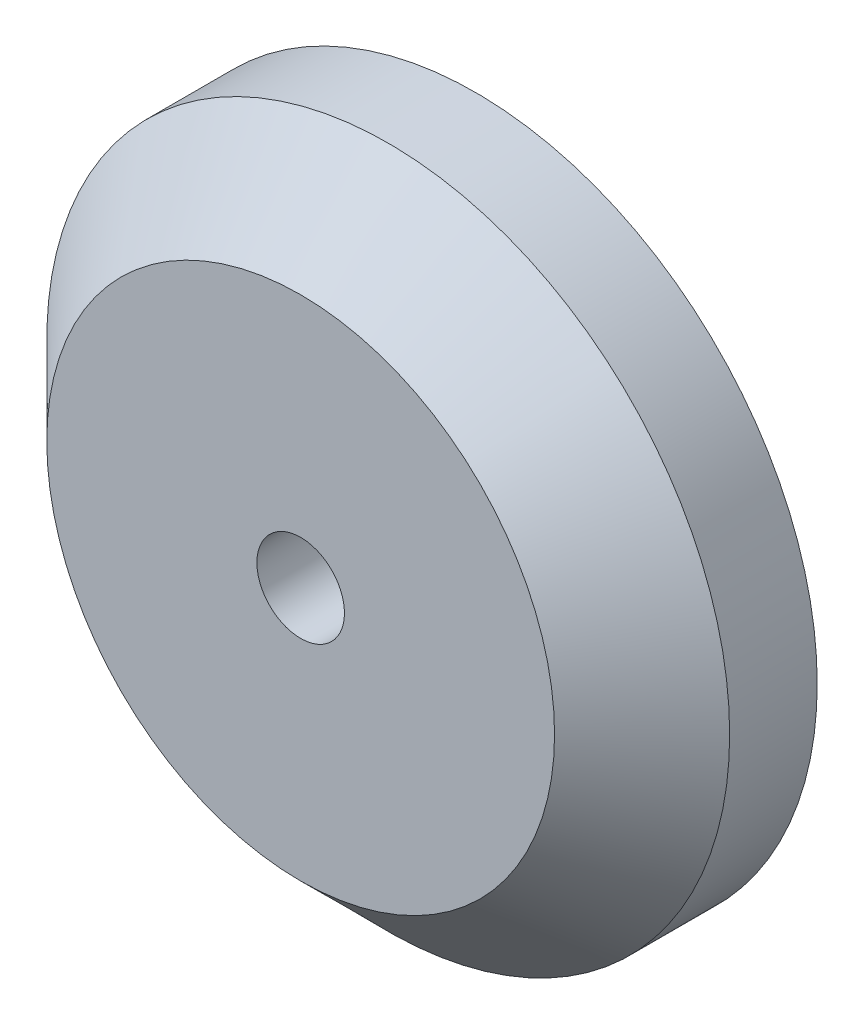
ISO-10303-21;
HEADER;
FILE_DESCRIPTION(('STEP AP214'),'2;1');
FILE_NAME('part.step','',(''),(''),'','','');
FILE_SCHEMA(('AUTOMOTIVE_DESIGN { 1 0 10303 214 1 1 1 1 }'));
ENDSEC;
DATA;
#1=APPLICATION_CONTEXT('core data for automotive mechanical design processes');
#2=APPLICATION_PROTOCOL_DEFINITION('international standard','automotive_design',2000,#1);
#3=PRODUCT_CONTEXT('',#1,'mechanical');
#4=PRODUCT('Part','Part','',(#3));
#5=PRODUCT_RELATED_PRODUCT_CATEGORY('part','',(#4));
#6=PRODUCT_DEFINITION_FORMATION('','',#4);
#7=PRODUCT_DEFINITION_CONTEXT('part definition',#1,'design');
#8=PRODUCT_DEFINITION('design','',#6,#7);
#9=PRODUCT_DEFINITION_SHAPE('','',#8);
#10=(LENGTH_UNIT() NAMED_UNIT(*) SI_UNIT(.MILLI.,.METRE.));
#11=(NAMED_UNIT(*) PLANE_ANGLE_UNIT() SI_UNIT($,.RADIAN.));
#12=(NAMED_UNIT(*) SI_UNIT($,.STERADIAN.) SOLID_ANGLE_UNIT());
#13=UNCERTAINTY_MEASURE_WITH_UNIT(LENGTH_MEASURE(1.E-05),#10,'distance_accuracy_value','');
#14=(GEOMETRIC_REPRESENTATION_CONTEXT(3) GLOBAL_UNCERTAINTY_ASSIGNED_CONTEXT((#13)) GLOBAL_UNIT_ASSIGNED_CONTEXT((#10,
#11,#12)) REPRESENTATION_CONTEXT('',''));
#15=CARTESIAN_POINT('',(0.,0.,0.));
#16=DIRECTION('',(0.,0.,1.));
#17=DIRECTION('',(1.,0.,0.));
#18=AXIS2_PLACEMENT_3D('',#15,#16,#17);
#19=CARTESIAN_POINT('',(0.,0.,5.));
#20=DIRECTION('',(0.,0.,-1.));
#21=DIRECTION('',(-1.,0.,0.));
#22=AXIS2_PLACEMENT_3D('',#19,#20,#21);
#23=CYLINDRICAL_SURFACE('',#22,1.25);
#24=CARTESIAN_POINT('',(0.,0.,5.));
#25=DIRECTION('',(0.,0.,-1.));
#26=DIRECTION('',(-1.,0.,0.));
#27=AXIS2_PLACEMENT_3D('',#24,#25,#26);
#28=CIRCLE('',#27,1.25);
#29=CARTESIAN_POINT('',(-1.25,0.,5.));
#30=VERTEX_POINT('',#29);
#31=EDGE_CURVE('E53',#30,#30,#28,.T.);
#32=ORIENTED_EDGE('',*,*,#31,.F.);
#33=EDGE_LOOP('',(#32));
#34=FACE_BOUND('',#33,.T.);
#35=CARTESIAN_POINT('',(0.,0.,2.5));
#36=DIRECTION('',(0.,0.,-1.));
#37=DIRECTION('',(-1.,0.,0.));
#38=AXIS2_PLACEMENT_3D('',#35,#36,#37);
#39=CIRCLE('',#38,1.25);
#40=CARTESIAN_POINT('',(-1.25,0.,2.5));
#41=VERTEX_POINT('',#40);
#42=EDGE_CURVE('E40',#41,#41,#39,.F.);
#43=ORIENTED_EDGE('',*,*,#42,.F.);
#44=EDGE_LOOP('',(#43));
#45=FACE_BOUND('',#44,.T.);
#46=ADVANCED_FACE('F35',(#34,#45),#23,.F.);
#47=CARTESIAN_POINT('',(0.,0.,5.));
#48=DIRECTION('',(0.,0.,-1.));
#49=DIRECTION('',(-1.,0.,0.));
#50=AXIS2_PLACEMENT_3D('',#47,#48,#49);
#51=CYLINDRICAL_SURFACE('',#50,9.75);
#52=CARTESIAN_POINT('',(0.,0.,2.49999999999998));
#53=DIRECTION('',(0.,0.,1.));
#54=DIRECTION('',(1.,0.,0.));
#55=AXIS2_PLACEMENT_3D('',#52,#53,#54);
#56=CIRCLE('',#55,9.75);
#57=CARTESIAN_POINT('',(9.75,0.,2.49999999999998));
#58=VERTEX_POINT('',#57);
#59=EDGE_CURVE('E10',#58,#58,#56,.F.);
#60=ORIENTED_EDGE('',*,*,#59,.T.);
#61=EDGE_LOOP('',(#60));
#62=FACE_BOUND('',#61,.T.);
#63=CARTESIAN_POINT('',(0.,0.,0.));
#64=DIRECTION('',(0.,0.,1.));
#65=DIRECTION('',(1.,0.,0.));
#66=AXIS2_PLACEMENT_3D('',#63,#64,#65);
#67=CIRCLE('',#66,9.75);
#68=CARTESIAN_POINT('',(9.75,0.,0.));
#69=VERTEX_POINT('',#68);
#70=EDGE_CURVE('E48',#69,#69,#67,.T.);
#71=ORIENTED_EDGE('',*,*,#70,.T.);
#72=EDGE_LOOP('',(#71));
#73=FACE_BOUND('',#72,.T.);
#74=ADVANCED_FACE('F69',(#62,#73),#51,.T.);
#75=CARTESIAN_POINT('',(0.,0.,5.));
#76=DIRECTION('',(0.,0.,1.));
#77=DIRECTION('',(1.,0.,0.));
#78=AXIS2_PLACEMENT_3D('',#75,#76,#77);
#79=PLANE('',#78);
#80=CARTESIAN_POINT('',(0.,0.,5.));
#81=DIRECTION('',(0.,0.,1.));
#82=DIRECTION('',(1.,0.,0.));
#83=AXIS2_PLACEMENT_3D('',#80,#81,#82);
#84=CIRCLE('',#83,7.24999999999999);
#85=CARTESIAN_POINT('',(7.24999999999999,0.,5.));
#86=VERTEX_POINT('',#85);
#87=EDGE_CURVE('E44',#86,#86,#84,.T.);
#88=ORIENTED_EDGE('',*,*,#87,.T.);
#89=EDGE_LOOP('',(#88));
#90=FACE_BOUND('',#89,.T.);
#91=ORIENTED_EDGE('',*,*,#31,.T.);
#92=EDGE_LOOP('',(#91));
#93=FACE_BOUND('',#92,.T.);
#94=ADVANCED_FACE('F75',(#90,#93),#79,.T.);
#95=CARTESIAN_POINT('',(0.,0.,0.));
#96=DIRECTION('',(0.,0.,1.));
#97=DIRECTION('',(1.,0.,0.));
#98=AXIS2_PLACEMENT_3D('',#95,#96,#97);
#99=PLANE('',#98);
#100=CARTESIAN_POINT('',(0.,0.,0.));
#101=DIRECTION('',(0.,0.,-1.));
#102=DIRECTION('',(-1.,0.,0.));
#103=AXIS2_PLACEMENT_3D('',#100,#101,#102);
#104=CIRCLE('',#103,2.5);
#105=CARTESIAN_POINT('',(-2.5,0.,0.));
#106=VERTEX_POINT('',#105);
#107=EDGE_CURVE('E56',#106,#106,#104,.T.);
#108=ORIENTED_EDGE('',*,*,#107,.F.);
#109=EDGE_LOOP('',(#108));
#110=FACE_BOUND('',#109,.T.);
#111=ORIENTED_EDGE('',*,*,#70,.F.);
#112=EDGE_LOOP('',(#111));
#113=FACE_BOUND('',#112,.T.);
#114=ADVANCED_FACE('F83',(#110,#113),#99,.F.);
#115=CARTESIAN_POINT('',(0.,0.,5.));
#116=DIRECTION('',(0.,0.,-1.));
#117=DIRECTION('',(-1.,0.,0.));
#118=AXIS2_PLACEMENT_3D('',#115,#116,#117);
#119=CONICAL_SURFACE('',#118,7.24999999999999,0.785398163397447);
#120=ORIENTED_EDGE('',*,*,#59,.F.);
#121=EDGE_LOOP('',(#120));
#122=FACE_BOUND('',#121,.T.);
#123=ORIENTED_EDGE('',*,*,#87,.F.);
#124=EDGE_LOOP('',(#123));
#125=FACE_BOUND('',#124,.T.);
#126=ADVANCED_FACE('F38',(#122,#125),#119,.T.);
#127=CARTESIAN_POINT('',(0.,0.,2.5));
#128=DIRECTION('',(0.,0.,-1.));
#129=DIRECTION('',(-1.,0.,0.));
#130=AXIS2_PLACEMENT_3D('',#127,#128,#129);
#131=PLANE('',#130);
#132=CARTESIAN_POINT('',(0.,0.,2.5));
#133=DIRECTION('',(0.,0.,-1.));
#134=DIRECTION('',(-1.,0.,0.));
#135=AXIS2_PLACEMENT_3D('',#132,#133,#134);
#136=CIRCLE('',#135,2.5);
#137=CARTESIAN_POINT('',(-2.5,0.,2.5));
#138=VERTEX_POINT('',#137);
#139=EDGE_CURVE('E59',#138,#138,#136,.T.);
#140=ORIENTED_EDGE('',*,*,#139,.T.);
#141=EDGE_LOOP('',(#140));
#142=FACE_BOUND('',#141,.T.);
#143=ORIENTED_EDGE('',*,*,#42,.T.);
#144=EDGE_LOOP('',(#143));
#145=FACE_BOUND('',#144,.T.);
#146=ADVANCED_FACE('F66',(#142,#145),#131,.T.);
#147=CARTESIAN_POINT('',(0.,0.,2.5));
#148=DIRECTION('',(0.,0.,-1.));
#149=DIRECTION('',(-1.,0.,0.));
#150=AXIS2_PLACEMENT_3D('',#147,#148,#149);
#151=CYLINDRICAL_SURFACE('',#150,2.5);
#152=ORIENTED_EDGE('',*,*,#139,.F.);
#153=EDGE_LOOP('',(#152));
#154=FACE_BOUND('',#153,.T.);
#155=ORIENTED_EDGE('',*,*,#107,.T.);
#156=EDGE_LOOP('',(#155));
#157=FACE_BOUND('',#156,.T.);
#158=ADVANCED_FACE('F79',(#154,#157),#151,.F.);
#159=CLOSED_SHELL('',(#46,#74,#94,#114,#126,#146,#158));
#160=MANIFOLD_SOLID_BREP('B2',#159);
#161=ADVANCED_BREP_SHAPE_REPRESENTATION('',(#18,#160),#14);
#162=SHAPE_DEFINITION_REPRESENTATION(#9,#161);
ENDSEC;
END-ISO-10303-21;
